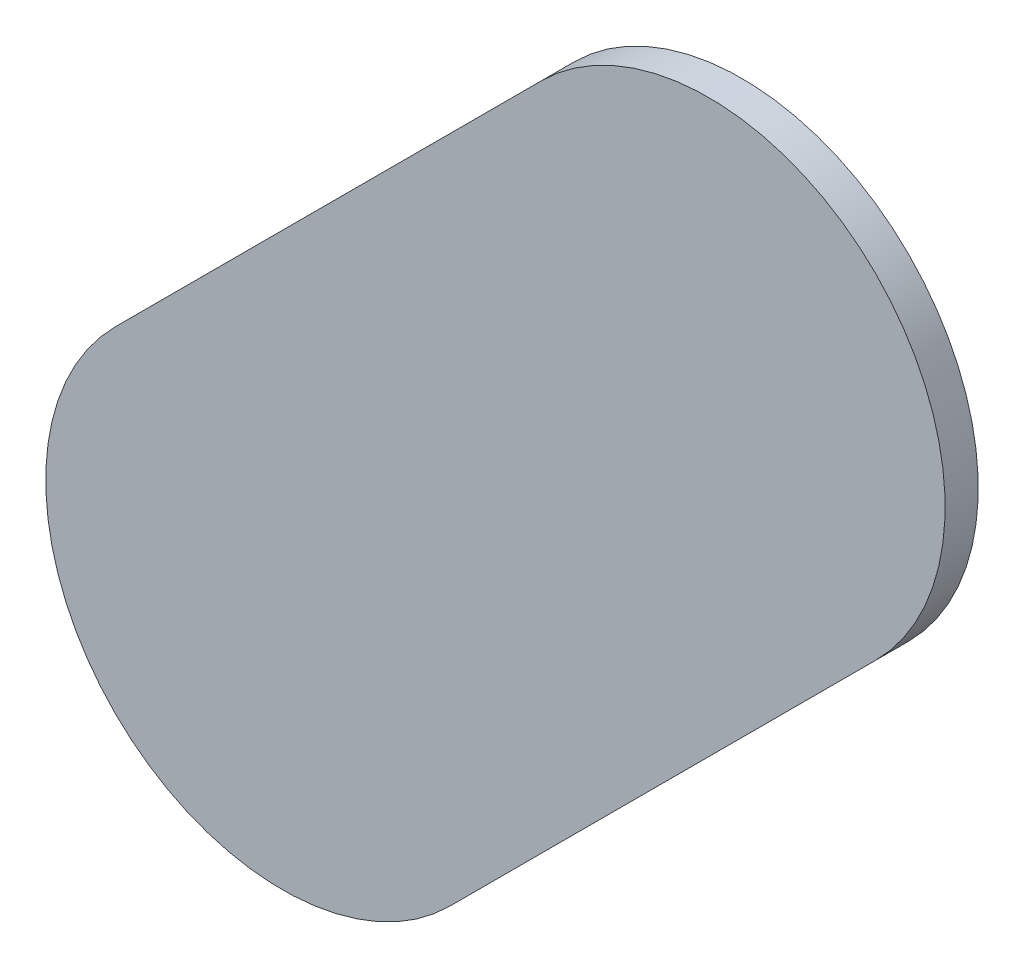
ISO-10303-21;
HEADER;
FILE_DESCRIPTION(('STEP AP214'),'2;1');
FILE_NAME('part.step','',(''),(''),'','','');
FILE_SCHEMA(('AUTOMOTIVE_DESIGN { 1 0 10303 214 1 1 1 1 }'));
ENDSEC;
DATA;
#1=APPLICATION_CONTEXT('core data for automotive mechanical design processes');
#2=APPLICATION_PROTOCOL_DEFINITION('international standard','automotive_design',2000,#1);
#3=PRODUCT_CONTEXT('',#1,'mechanical');
#4=PRODUCT('Part','Part','',(#3));
#5=PRODUCT_RELATED_PRODUCT_CATEGORY('part','',(#4));
#6=PRODUCT_DEFINITION_FORMATION('','',#4);
#7=PRODUCT_DEFINITION_CONTEXT('part definition',#1,'design');
#8=PRODUCT_DEFINITION('design','',#6,#7);
#9=PRODUCT_DEFINITION_SHAPE('','',#8);
#10=(LENGTH_UNIT() NAMED_UNIT(*) SI_UNIT(.MILLI.,.METRE.));
#11=(NAMED_UNIT(*) PLANE_ANGLE_UNIT() SI_UNIT($,.RADIAN.));
#12=(NAMED_UNIT(*) SI_UNIT($,.STERADIAN.) SOLID_ANGLE_UNIT());
#13=UNCERTAINTY_MEASURE_WITH_UNIT(LENGTH_MEASURE(1.E-05),#10,'distance_accuracy_value','');
#14=(GEOMETRIC_REPRESENTATION_CONTEXT(3) GLOBAL_UNCERTAINTY_ASSIGNED_CONTEXT((#13)) GLOBAL_UNIT_ASSIGNED_CONTEXT((#10,
#11,#12)) REPRESENTATION_CONTEXT('',''));
#15=CARTESIAN_POINT('',(0.,0.,0.));
#16=DIRECTION('',(0.,0.,1.));
#17=DIRECTION('',(1.,0.,0.));
#18=AXIS2_PLACEMENT_3D('',#15,#16,#17);
#19=CARTESIAN_POINT('',(96.174401,-124.823223,1.635));
#20=DIRECTION('',(0.,0.,1.));
#21=DIRECTION('',(1.,0.,0.));
#22=AXIS2_PLACEMENT_3D('',#19,#20,#21);
#23=PLANE('',#22);
#24=DIRECTION('',(-0.707106781186548,-0.707106781186548,0.));
#25=VECTOR('',#24,1.);
#26=CARTESIAN_POINT('',(96.174401,-124.823223,1.635));
#27=LINE('',#26,#25);
#28=CARTESIAN_POINT('',(96.174401,-124.823223,1.635));
#29=VERTEX_POINT('',#28);
#30=CARTESIAN_POINT('',(95.723812,-125.273812,1.635));
#31=VERTEX_POINT('',#30);
#32=EDGE_CURVE('E91',#29,#31,#27,.T.);
#33=ORIENTED_EDGE('',*,*,#32,.T.);
#34=CARTESIAN_POINT('',(95.9005885,-125.4505885,1.635));
#35=DIRECTION('',(0.,0.,1.));
#36=DIRECTION('',(-0.707106781186548,0.707106781186548,0.));
#37=AXIS2_PLACEMENT_3D('',#34,#35,#36);
#38=CIRCLE('',#37,0.249999723809);
#39=CARTESIAN_POINT('',(96.077365,-125.627365,1.635));
#40=VERTEX_POINT('',#39);
#41=EDGE_CURVE('E86',#31,#40,#38,.T.);
#42=ORIENTED_EDGE('',*,*,#41,.T.);
#43=DIRECTION('',(0.707106781186548,0.707106781186548,0.));
#44=VECTOR('',#43,1.);
#45=CARTESIAN_POINT('',(96.077365,-125.627365,1.635));
#46=LINE('',#45,#44);
#47=CARTESIAN_POINT('',(96.527954,-125.176776,1.635));
#48=VERTEX_POINT('',#47);
#49=EDGE_CURVE('E112',#40,#48,#46,.T.);
#50=ORIENTED_EDGE('',*,*,#49,.T.);
#51=CARTESIAN_POINT('',(96.3511775,-124.9999995,1.635));
#52=DIRECTION('',(0.,0.,1.));
#53=DIRECTION('',(0.707106781186548,-0.707106781186548,0.));
#54=AXIS2_PLACEMENT_3D('',#51,#52,#53);
#55=CIRCLE('',#54,0.249999723809);
#56=EDGE_CURVE('E11',#48,#29,#55,.T.);
#57=ORIENTED_EDGE('',*,*,#56,.T.);
#58=EDGE_LOOP('',(#33,#42,#50,#57));
#59=FACE_BOUND('',#58,.T.);
#60=ADVANCED_FACE('F17',(#59),#23,.T.);
#61=CARTESIAN_POINT('',(96.174401,-124.823223,1.6));
#62=DIRECTION('',(0.,0.,1.));
#63=DIRECTION('',(1.,0.,0.));
#64=AXIS2_PLACEMENT_3D('',#61,#62,#63);
#65=PLANE('',#64);
#66=CARTESIAN_POINT('',(96.3511775,-124.9999995,1.6));
#67=DIRECTION('',(0.,0.,1.));
#68=DIRECTION('',(0.707106781186548,-0.707106781186548,0.));
#69=AXIS2_PLACEMENT_3D('',#66,#67,#68);
#70=CIRCLE('',#69,0.249999723809);
#71=CARTESIAN_POINT('',(96.527954,-125.176776,1.6));
#72=VERTEX_POINT('',#71);
#73=CARTESIAN_POINT('',(96.174401,-124.823223,1.6));
#74=VERTEX_POINT('',#73);
#75=EDGE_CURVE('E21',#72,#74,#70,.T.);
#76=ORIENTED_EDGE('',*,*,#75,.F.);
#77=DIRECTION('',(0.707106781186548,0.707106781186548,0.));
#78=VECTOR('',#77,1.);
#79=CARTESIAN_POINT('',(96.077365,-125.627365,1.6));
#80=LINE('',#79,#78);
#81=CARTESIAN_POINT('',(96.077365,-125.627365,1.6));
#82=VERTEX_POINT('',#81);
#83=EDGE_CURVE('E74',#82,#72,#80,.T.);
#84=ORIENTED_EDGE('',*,*,#83,.F.);
#85=CARTESIAN_POINT('',(95.9005885,-125.4505885,1.6));
#86=DIRECTION('',(0.,0.,1.));
#87=DIRECTION('',(-0.707106781186548,0.707106781186548,0.));
#88=AXIS2_PLACEMENT_3D('',#85,#86,#87);
#89=CIRCLE('',#88,0.249999723809);
#90=CARTESIAN_POINT('',(95.723812,-125.273812,1.6));
#91=VERTEX_POINT('',#90);
#92=EDGE_CURVE('E69',#91,#82,#89,.T.);
#93=ORIENTED_EDGE('',*,*,#92,.F.);
#94=DIRECTION('',(-0.707106781186548,-0.707106781186548,0.));
#95=VECTOR('',#94,1.);
#96=CARTESIAN_POINT('',(96.174401,-124.823223,1.6));
#97=LINE('',#96,#95);
#98=EDGE_CURVE('E72',#74,#91,#97,.T.);
#99=ORIENTED_EDGE('',*,*,#98,.F.);
#100=EDGE_LOOP('',(#76,#84,#93,#99));
#101=FACE_BOUND('',#100,.T.);
#102=ADVANCED_FACE('F19',(#101),#65,.F.);
#103=CARTESIAN_POINT('',(96.3511775,-124.9999995,1.6));
#104=DIRECTION('',(0.,0.,-1.));
#105=DIRECTION('',(0.707106781186548,-0.707106781186548,0.));
#106=AXIS2_PLACEMENT_3D('',#103,#104,#105);
#107=CYLINDRICAL_SURFACE('',#106,0.249999723809);
#108=ORIENTED_EDGE('',*,*,#75,.T.);
#109=DIRECTION('',(0.,0.,1.));
#110=VECTOR('',#109,1.);
#111=CARTESIAN_POINT('',(96.174401,-124.823223,1.6));
#112=LINE('',#111,#110);
#113=EDGE_CURVE('E80',#74,#29,#112,.T.);
#114=ORIENTED_EDGE('',*,*,#113,.T.);
#115=ORIENTED_EDGE('',*,*,#56,.F.);
#116=DIRECTION('',(0.,0.,1.));
#117=VECTOR('',#116,1.);
#118=CARTESIAN_POINT('',(96.527954,-125.176776,1.6));
#119=LINE('',#118,#117);
#120=EDGE_CURVE('E111',#72,#48,#119,.T.);
#121=ORIENTED_EDGE('',*,*,#120,.F.);
#122=EDGE_LOOP('',(#108,#114,#115,#121));
#123=FACE_BOUND('',#122,.T.);
#124=ADVANCED_FACE('F120',(#123),#107,.T.);
#125=CARTESIAN_POINT('',(96.077365,-125.627365,1.6));
#126=DIRECTION('',(-0.707106781186548,0.707106781186548,0.));
#127=DIRECTION('',(0.,0.,1.));
#128=AXIS2_PLACEMENT_3D('',#125,#126,#127);
#129=PLANE('',#128);
#130=ORIENTED_EDGE('',*,*,#83,.T.);
#131=ORIENTED_EDGE('',*,*,#120,.T.);
#132=ORIENTED_EDGE('',*,*,#49,.F.);
#133=DIRECTION('',(0.,0.,1.));
#134=VECTOR('',#133,1.);
#135=CARTESIAN_POINT('',(96.077365,-125.627365,1.6));
#136=LINE('',#135,#134);
#137=EDGE_CURVE('E79',#82,#40,#136,.T.);
#138=ORIENTED_EDGE('',*,*,#137,.F.);
#139=EDGE_LOOP('',(#130,#131,#132,#138));
#140=FACE_BOUND('',#139,.T.);
#141=ADVANCED_FACE('F119',(#140),#129,.F.);
#142=CARTESIAN_POINT('',(95.9005885,-125.4505885,1.6));
#143=DIRECTION('',(0.,0.,-1.));
#144=DIRECTION('',(-0.707106781186548,0.707106781186548,0.));
#145=AXIS2_PLACEMENT_3D('',#142,#143,#144);
#146=CYLINDRICAL_SURFACE('',#145,0.249999723809);
#147=ORIENTED_EDGE('',*,*,#92,.T.);
#148=ORIENTED_EDGE('',*,*,#137,.T.);
#149=ORIENTED_EDGE('',*,*,#41,.F.);
#150=DIRECTION('',(0.,0.,1.));
#151=VECTOR('',#150,1.);
#152=CARTESIAN_POINT('',(95.723812,-125.273812,1.6));
#153=LINE('',#152,#151);
#154=EDGE_CURVE('E83',#91,#31,#153,.T.);
#155=ORIENTED_EDGE('',*,*,#154,.F.);
#156=EDGE_LOOP('',(#147,#148,#149,#155));
#157=FACE_BOUND('',#156,.T.);
#158=ADVANCED_FACE('F84',(#157),#146,.T.);
#159=CARTESIAN_POINT('',(96.174401,-124.823223,1.6));
#160=DIRECTION('',(0.707106781186548,-0.707106781186548,0.));
#161=DIRECTION('',(0.,0.,-1.));
#162=AXIS2_PLACEMENT_3D('',#159,#160,#161);
#163=PLANE('',#162);
#164=ORIENTED_EDGE('',*,*,#98,.T.);
#165=ORIENTED_EDGE('',*,*,#154,.T.);
#166=ORIENTED_EDGE('',*,*,#32,.F.);
#167=ORIENTED_EDGE('',*,*,#113,.F.);
#168=EDGE_LOOP('',(#164,#165,#166,#167));
#169=FACE_BOUND('',#168,.T.);
#170=ADVANCED_FACE('F94',(#169),#163,.F.);
#171=CLOSED_SHELL('',(#60,#102,#124,#141,#158,#170));
#172=MANIFOLD_SOLID_BREP('B1',#171);
#173=ADVANCED_BREP_SHAPE_REPRESENTATION('',(#18,#172),#14);
#174=SHAPE_DEFINITION_REPRESENTATION(#9,#173);
ENDSEC;
END-ISO-10303-21;
